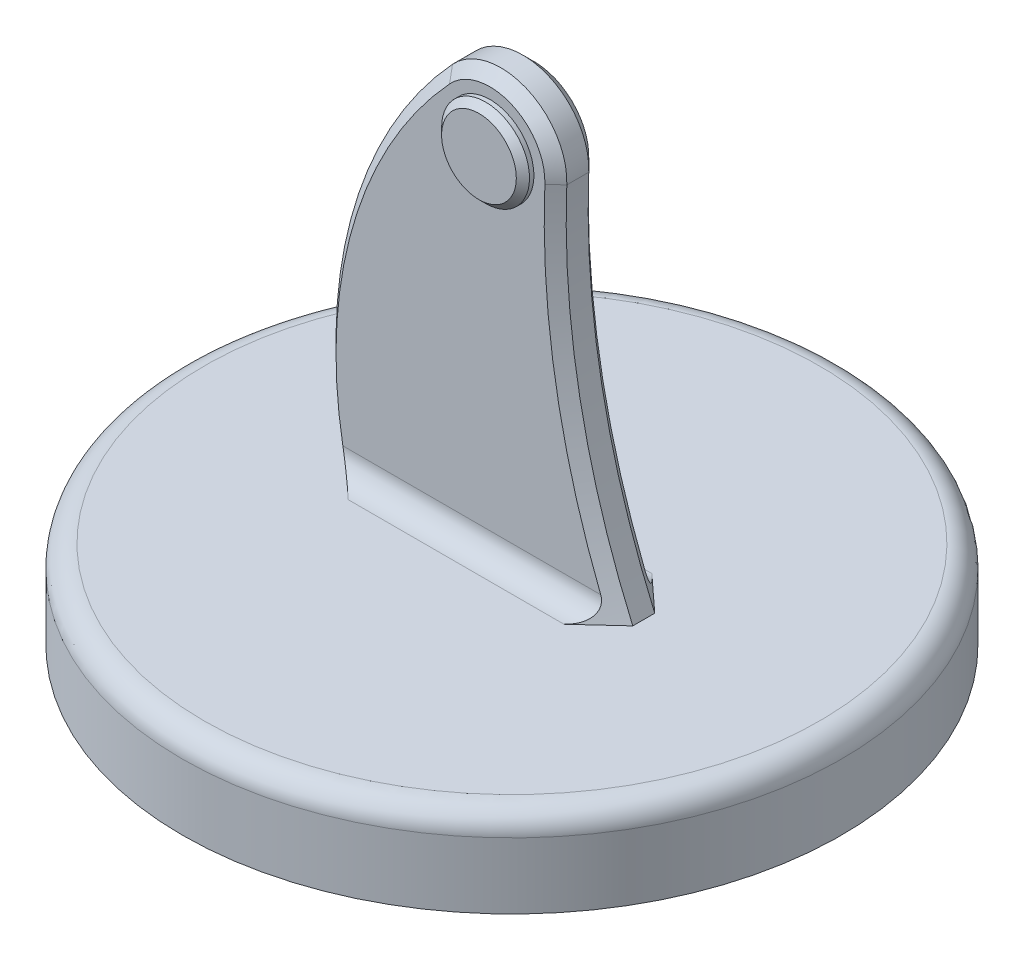
ISO-10303-21;
HEADER;
FILE_DESCRIPTION(('STEP AP214'),'2;1');
FILE_NAME('part.step','',(''),(''),'','','');
FILE_SCHEMA(('AUTOMOTIVE_DESIGN { 1 0 10303 214 1 1 1 1 }'));
ENDSEC;
DATA;
#1=APPLICATION_CONTEXT('core data for automotive mechanical design processes');
#2=APPLICATION_PROTOCOL_DEFINITION('international standard','automotive_design',2000,#1);
#3=PRODUCT_CONTEXT('',#1,'mechanical');
#4=PRODUCT('Part','Part','',(#3));
#5=PRODUCT_RELATED_PRODUCT_CATEGORY('part','',(#4));
#6=PRODUCT_DEFINITION_FORMATION('','',#4);
#7=PRODUCT_DEFINITION_CONTEXT('part definition',#1,'design');
#8=PRODUCT_DEFINITION('design','',#6,#7);
#9=PRODUCT_DEFINITION_SHAPE('','',#8);
#10=(LENGTH_UNIT() NAMED_UNIT(*) SI_UNIT(.MILLI.,.METRE.));
#11=(NAMED_UNIT(*) PLANE_ANGLE_UNIT() SI_UNIT($,.RADIAN.));
#12=(NAMED_UNIT(*) SI_UNIT($,.STERADIAN.) SOLID_ANGLE_UNIT());
#13=UNCERTAINTY_MEASURE_WITH_UNIT(LENGTH_MEASURE(1.E-05),#10,'distance_accuracy_value','');
#14=(GEOMETRIC_REPRESENTATION_CONTEXT(3) GLOBAL_UNCERTAINTY_ASSIGNED_CONTEXT((#13)) GLOBAL_UNIT_ASSIGNED_CONTEXT((#10,
#11,#12)) REPRESENTATION_CONTEXT('',''));
#15=CARTESIAN_POINT('',(0.,0.,0.));
#16=DIRECTION('',(0.,0.,1.));
#17=DIRECTION('',(1.,0.,0.));
#18=AXIS2_PLACEMENT_3D('',#15,#16,#17);
#19=CARTESIAN_POINT('',(0.,20.,0.));
#20=DIRECTION('',(0.,-1.,0.));
#21=DIRECTION('',(0.,0.,-1.));
#22=AXIS2_PLACEMENT_3D('',#19,#20,#21);
#23=CYLINDRICAL_SURFACE('',#22,75.);
#24=CARTESIAN_POINT('',(0.,15.,0.));
#25=DIRECTION('',(0.,1.,0.));
#26=DIRECTION('',(0.,0.,1.));
#27=AXIS2_PLACEMENT_3D('',#24,#25,#26);
#28=CIRCLE('',#27,75.);
#29=CARTESIAN_POINT('',(0.,15.,75.));
#30=VERTEX_POINT('',#29);
#31=EDGE_CURVE('E157',#30,#30,#28,.F.);
#32=ORIENTED_EDGE('',*,*,#31,.T.);
#33=EDGE_LOOP('',(#32));
#34=FACE_BOUND('',#33,.T.);
#35=CARTESIAN_POINT('',(0.,0.,0.));
#36=DIRECTION('',(0.,1.,0.));
#37=DIRECTION('',(0.,0.,1.));
#38=AXIS2_PLACEMENT_3D('',#35,#36,#37);
#39=CIRCLE('',#38,75.);
#40=CARTESIAN_POINT('',(0.,0.,75.));
#41=VERTEX_POINT('',#40);
#42=EDGE_CURVE('E140',#41,#41,#39,.T.);
#43=ORIENTED_EDGE('',*,*,#42,.T.);
#44=EDGE_LOOP('',(#43));
#45=FACE_BOUND('',#44,.T.);
#46=ADVANCED_FACE('F50',(#34,#45),#23,.T.);
#47=CARTESIAN_POINT('',(0.,20.,0.));
#48=DIRECTION('',(0.,1.,0.));
#49=DIRECTION('',(0.,0.,1.));
#50=AXIS2_PLACEMENT_3D('',#47,#48,#49);
#51=PLANE('',#50);
#52=DIRECTION('',(1.,0.,0.));
#53=VECTOR('',#52,1.);
#54=CARTESIAN_POINT('',(27.2737881575031,20.,-10.));
#55=LINE('',#54,#53);
#56=CARTESIAN_POINT('',(-27.2887355473297,20.,-10.));
#57=VERTEX_POINT('',#56);
#58=CARTESIAN_POINT('',(21.8418637199152,20.,-10.));
#59=VERTEX_POINT('',#58);
#60=EDGE_CURVE('E237',#57,#59,#55,.T.);
#61=ORIENTED_EDGE('',*,*,#60,.T.);
#62=CARTESIAN_POINT('',(21.8418637199152,20.,-10.0000000000159));
#63=CARTESIAN_POINT('',(22.7461882017297,20.,-9.16558426966586));
#64=CARTESIAN_POINT('',(23.6509965192312,20.,-8.33169268853577));
#65=CARTESIAN_POINT('',(25.4616234405496,20.,-6.66500921803442));
#66=CARTESIAN_POINT('',(26.3674420431797,20.,-5.83221732737389));
#67=CARTESIAN_POINT('',(27.7278878786498,20.,-4.58304046288528));
#68=CARTESIAN_POINT('',(28.1821200176084,20.,-4.1662251546363));
#69=CARTESIAN_POINT('',(29.0908553232679,20.,-3.33288955358244));
#70=CARTESIAN_POINT('',(29.5453584901279,20.,-2.91636926095111));
#71=CARTESIAN_POINT('',(30.,20.,-2.50000000000006));
#72=B_SPLINE_CURVE_WITH_KNOTS('',3,(#62,#63,#64,#65,#66,#67,#68,#69,#70,#71),.UNSPECIFIED.,.F.,
.F.,(4,2,2,2,4),(0.,3.69140512288142,7.38280591413322,9.23228046194418,11.0817560968989),.UNSPECIFIED.);
#73=CARTESIAN_POINT('',(30.,20.,-2.50000000000005));
#74=VERTEX_POINT('',#73);
#75=EDGE_CURVE('E149',#59,#74,#72,.T.);
#76=ORIENTED_EDGE('',*,*,#75,.T.);
#77=DIRECTION('',(0.,0.,-1.));
#78=VECTOR('',#77,1.);
#79=CARTESIAN_POINT('',(30.,20.,5.));
#80=LINE('',#79,#78);
#81=CARTESIAN_POINT('',(30.,20.,2.5));
#82=VERTEX_POINT('',#81);
#83=EDGE_CURVE('E139',#82,#74,#80,.T.);
#84=ORIENTED_EDGE('',*,*,#83,.F.);
#85=CARTESIAN_POINT('',(30.,20.,2.5));
#86=CARTESIAN_POINT('',(29.5453584901279,20.,2.91636926095106));
#87=CARTESIAN_POINT('',(29.0908553232678,20.,3.3328895535824));
#88=CARTESIAN_POINT('',(28.1821200176084,20.,4.16622515463628));
#89=CARTESIAN_POINT('',(27.7278878786498,20.,4.58304046288527));
#90=CARTESIAN_POINT('',(26.3674420431826,20.,5.83221732737125));
#91=CARTESIAN_POINT('',(25.4616234405553,20.,6.66500921802913));
#92=CARTESIAN_POINT('',(23.6509965192427,20.,8.33169268852517));
#93=CARTESIAN_POINT('',(22.746188201744,20.,9.1655842696526));
#94=CARTESIAN_POINT('',(21.8418637199324,20.,10.));
#95=B_SPLINE_CURVE_WITH_KNOTS('',3,(#85,#86,#87,#88,#89,#90,#91,#92,#93,#94),.UNSPECIFIED.,.F.,
.F.,(4,2,2,2,4),(0.,1.84947563495476,3.69895018276575,7.39035097400581,11.0817560968755),.UNSPECIFIED.);
#96=CARTESIAN_POINT('',(21.8418637199324,20.,10.));
#97=VERTEX_POINT('',#96);
#98=EDGE_CURVE('E207',#82,#97,#95,.T.);
#99=ORIENTED_EDGE('',*,*,#98,.T.);
#100=DIRECTION('',(1.,0.,0.));
#101=VECTOR('',#100,1.);
#102=CARTESIAN_POINT('',(0.,20.,10.));
#103=LINE('',#102,#101);
#104=CARTESIAN_POINT('',(-27.2887355473191,20.,10.));
#105=VERTEX_POINT('',#104);
#106=EDGE_CURVE('E335',#97,#105,#103,.F.);
#107=ORIENTED_EDGE('',*,*,#106,.T.);
#108=CARTESIAN_POINT('',(-27.2887355473191,20.,10.));
#109=CARTESIAN_POINT('',(-28.1468298222042,20.,9.16734576652844));
#110=CARTESIAN_POINT('',(-29.004577468134,20.,8.33433437714162));
#111=CARTESIAN_POINT('',(-30.7194292699949,20.,6.66765018811386));
#112=CARTESIAN_POINT('',(-31.5765334261847,20.,5.83397738873913));
#113=CARTESIAN_POINT('',(-32.8612617911927,20.,4.58348152868409));
#114=CARTESIAN_POINT('',(-33.2891085540013,20.,4.16688708166744));
#115=CARTESIAN_POINT('',(-34.1446597093332,20.,3.33355184941637));
#116=CARTESIAN_POINT('',(-34.5723641018279,20.,2.91681106415259));
#117=CARTESIAN_POINT('',(-35.,20.,2.5));
#118=B_SPLINE_CURVE_WITH_KNOTS('',3,(#108,#109,#110,#111,#112,#113,#114,#115,#116,#117),
.UNSPECIFIED.,.F.,.F.,(4,2,2,2,4),(0.,3.58702503188647,7.17404862068496,8.96553793676738,
10.7570276125337),.UNSPECIFIED.);
#119=CARTESIAN_POINT('',(-35.,20.,2.5));
#120=VERTEX_POINT('',#119);
#121=EDGE_CURVE('E133',#105,#120,#118,.T.);
#122=ORIENTED_EDGE('',*,*,#121,.T.);
#123=DIRECTION('',(0.,0.,-1.));
#124=VECTOR('',#123,1.);
#125=CARTESIAN_POINT('',(-35.,20.,5.));
#126=LINE('',#125,#124);
#127=CARTESIAN_POINT('',(-35.,20.,-2.50000000000005));
#128=VERTEX_POINT('',#127);
#129=EDGE_CURVE('E123',#120,#128,#126,.T.);
#130=ORIENTED_EDGE('',*,*,#129,.T.);
#131=CARTESIAN_POINT('',(-35.,20.,-2.50000000000005));
#132=CARTESIAN_POINT('',(-34.5723641018279,20.,-2.91681106415264));
#133=CARTESIAN_POINT('',(-34.1446597093332,20.,-3.33355184941641));
#134=CARTESIAN_POINT('',(-33.2891085540013,20.,-4.16688708166746));
#135=CARTESIAN_POINT('',(-32.8612617911927,20.,-4.5834815286841));
#136=CARTESIAN_POINT('',(-31.5765334261864,20.,-5.83397738873742));
#137=CARTESIAN_POINT('',(-30.7194292699984,20.,-6.66765018811043));
#138=CARTESIAN_POINT('',(-29.0045774681411,20.,-8.33433437713477));
#139=CARTESIAN_POINT('',(-28.146829822213,20.,-9.16734576651988));
#140=CARTESIAN_POINT('',(-27.2887355473297,20.,-9.99999999998973));
#141=B_SPLINE_CURVE_WITH_KNOTS('',3,(#131,#132,#133,#134,#135,#136,#137,#138,#139,#140),
.UNSPECIFIED.,.F.,.F.,(4,2,2,2,4),(0.,1.79148967576627,3.58297899184866,7.17000258063981,
10.7570276125189),.UNSPECIFIED.);
#142=EDGE_CURVE('E128',#128,#57,#141,.T.);
#143=ORIENTED_EDGE('',*,*,#142,.T.);
#144=EDGE_LOOP('',(#61,#76,#84,#99,#107,#122,#130,#143));
#145=FACE_BOUND('',#144,.T.);
#146=CARTESIAN_POINT('',(0.,20.,0.));
#147=DIRECTION('',(0.,1.,0.));
#148=DIRECTION('',(0.,0.,1.));
#149=AXIS2_PLACEMENT_3D('',#146,#147,#148);
#150=CIRCLE('',#149,70.);
#151=CARTESIAN_POINT('',(0.,20.,70.));
#152=VERTEX_POINT('',#151);
#153=EDGE_CURVE('E163',#152,#152,#150,.T.);
#154=ORIENTED_EDGE('',*,*,#153,.T.);
#155=EDGE_LOOP('',(#154));
#156=FACE_BOUND('',#155,.T.);
#157=ADVANCED_FACE('F129',(#145,#156),#51,.T.);
#158=CARTESIAN_POINT('',(0.,0.,0.));
#159=DIRECTION('',(0.,1.,0.));
#160=DIRECTION('',(0.,0.,1.));
#161=AXIS2_PLACEMENT_3D('',#158,#159,#160);
#162=PLANE('',#161);
#163=ORIENTED_EDGE('',*,*,#42,.F.);
#164=EDGE_LOOP('',(#163));
#165=FACE_BOUND('',#164,.T.);
#166=ADVANCED_FACE('F195',(#165),#162,.F.);
#167=CARTESIAN_POINT('',(0.,15.,0.));
#168=DIRECTION('',(0.,1.,0.));
#169=DIRECTION('',(0.,0.,1.));
#170=AXIS2_PLACEMENT_3D('',#167,#168,#169);
#171=TOROIDAL_SURFACE('',#170,70.,5.);
#172=ORIENTED_EDGE('',*,*,#31,.F.);
#173=EDGE_LOOP('',(#172));
#174=FACE_BOUND('',#173,.T.);
#175=ORIENTED_EDGE('',*,*,#153,.F.);
#176=EDGE_LOOP('',(#175));
#177=FACE_BOUND('',#176,.T.);
#178=ADVANCED_FACE('F295',(#174,#177),#171,.T.);
#179=CARTESIAN_POINT('',(62.4686842011093,42.3574506620147,5.));
#180=DIRECTION('',(0.,0.,-1.));
#181=DIRECTION('',(-1.,0.,0.));
#182=AXIS2_PLACEMENT_3D('',#179,#180,#181);
#183=CYLINDRICAL_SURFACE('',#182,100.);
#184=ORIENTED_EDGE('',*,*,#129,.F.);
#185=CARTESIAN_POINT('',(62.4686842011093,42.3574506620147,2.5));
#186=DIRECTION('',(0.,0.,-1.));
#187=DIRECTION('',(-1.,0.,0.));
#188=AXIS2_PLACEMENT_3D('',#185,#186,#187);
#189=CIRCLE('',#188,100.);
#190=CARTESIAN_POINT('',(-11.0238854472546,110.172214589056,2.5));
#191=VERTEX_POINT('',#190);
#192=EDGE_CURVE('E349',#120,#191,#189,.T.);
#193=ORIENTED_EDGE('',*,*,#192,.T.);
#194=DIRECTION('',(0.,0.,-1.));
#195=VECTOR('',#194,1.);
#196=CARTESIAN_POINT('',(-11.0238854472546,110.172214589056,5.));
#197=LINE('',#196,#195);
#198=CARTESIAN_POINT('',(-11.0238854472546,110.172214589056,-2.50000000000005));
#199=VERTEX_POINT('',#198);
#200=EDGE_CURVE('E153',#191,#199,#197,.T.);
#201=ORIENTED_EDGE('',*,*,#200,.T.);
#202=CARTESIAN_POINT('',(62.4686842011093,42.3574506620147,-2.50000000000005));
#203=DIRECTION('',(0.,0.,-1.));
#204=DIRECTION('',(-1.,0.,0.));
#205=AXIS2_PLACEMENT_3D('',#202,#203,#204);
#206=CIRCLE('',#205,100.);
#207=EDGE_CURVE('E144',#199,#128,#206,.F.);
#208=ORIENTED_EDGE('',*,*,#207,.T.);
#209=EDGE_LOOP('',(#184,#193,#201,#208));
#210=FACE_BOUND('',#209,.T.);
#211=ADVANCED_FACE('F152',(#210),#183,.T.);
#212=CARTESIAN_POINT('',(194.847381809951,92.2865181787317,5.));
#213=DIRECTION('',(0.,0.,-1.));
#214=DIRECTION('',(-1.,0.,0.));
#215=AXIS2_PLACEMENT_3D('',#212,#213,#214);
#216=CYLINDRICAL_SURFACE('',#215,180.);
#217=DIRECTION('',(0.,0.,-1.));
#218=VECTOR('',#217,1.);
#219=CARTESIAN_POINT('',(14.988260139227,99.4066552445178,5.));
#220=LINE('',#219,#218);
#221=CARTESIAN_POINT('',(14.988260139227,99.4066552445178,2.5));
#222=VERTEX_POINT('',#221);
#223=CARTESIAN_POINT('',(14.988260139227,99.4066552445178,-2.50000000000005));
#224=VERTEX_POINT('',#223);
#225=EDGE_CURVE('E311',#222,#224,#220,.T.);
#226=ORIENTED_EDGE('',*,*,#225,.F.);
#227=CARTESIAN_POINT('',(194.847381809951,92.2865181787317,2.5));
#228=DIRECTION('',(0.,0.,-1.));
#229=DIRECTION('',(-1.,0.,0.));
#230=AXIS2_PLACEMENT_3D('',#227,#228,#229);
#231=CIRCLE('',#230,180.);
#232=EDGE_CURVE('E210',#222,#82,#231,.F.);
#233=ORIENTED_EDGE('',*,*,#232,.T.);
#234=ORIENTED_EDGE('',*,*,#83,.T.);
#235=CARTESIAN_POINT('',(194.847381809951,92.2865181787317,-2.50000000000005));
#236=DIRECTION('',(0.,0.,-1.));
#237=DIRECTION('',(-1.,0.,0.));
#238=AXIS2_PLACEMENT_3D('',#235,#236,#237);
#239=CIRCLE('',#238,180.);
#240=EDGE_CURVE('E146',#74,#224,#239,.T.);
#241=ORIENTED_EDGE('',*,*,#240,.T.);
#242=EDGE_LOOP('',(#226,#233,#234,#241));
#243=FACE_BOUND('',#242,.T.);
#244=ADVANCED_FACE('F301',(#243),#216,.F.);
#245=CARTESIAN_POINT('',(0.,100.,5.));
#246=DIRECTION('',(0.,0.,-1.));
#247=DIRECTION('',(-1.,0.,0.));
#248=AXIS2_PLACEMENT_3D('',#245,#246,#247);
#249=CYLINDRICAL_SURFACE('',#248,15.);
#250=ORIENTED_EDGE('',*,*,#200,.F.);
#251=CARTESIAN_POINT('',(0.,100.,2.5));
#252=DIRECTION('',(0.,0.,-1.));
#253=DIRECTION('',(-1.,0.,0.));
#254=AXIS2_PLACEMENT_3D('',#251,#252,#253);
#255=CIRCLE('',#254,15.);
#256=EDGE_CURVE('E352',#191,#222,#255,.T.);
#257=ORIENTED_EDGE('',*,*,#256,.T.);
#258=ORIENTED_EDGE('',*,*,#225,.T.);
#259=CARTESIAN_POINT('',(0.,100.,-2.50000000000005));
#260=DIRECTION('',(0.,0.,-1.));
#261=DIRECTION('',(-1.,0.,0.));
#262=AXIS2_PLACEMENT_3D('',#259,#260,#261);
#263=CIRCLE('',#262,15.);
#264=EDGE_CURVE('E166',#224,#199,#263,.F.);
#265=ORIENTED_EDGE('',*,*,#264,.T.);
#266=EDGE_LOOP('',(#250,#257,#258,#265));
#267=FACE_BOUND('',#266,.T.);
#268=ADVANCED_FACE('F369',(#267),#249,.T.);
#269=CARTESIAN_POINT('',(62.4686842011093,42.3574506620147,5.));
#270=DIRECTION('',(0.,0.,-1.));
#271=DIRECTION('',(-1.,0.,0.));
#272=AXIS2_PLACEMENT_3D('',#269,#270,#271);
#273=PLANE('',#272);
#274=CARTESIAN_POINT('',(0.,100.,5.));
#275=DIRECTION('',(0.,0.,-1.));
#276=DIRECTION('',(-1.,0.,0.));
#277=AXIS2_PLACEMENT_3D('',#274,#275,#276);
#278=CIRCLE('',#277,10.);
#279=CARTESIAN_POINT('',(-10.,100.,5.));
#280=VERTEX_POINT('',#279);
#281=EDGE_CURVE('E272',#280,#280,#278,.F.);
#282=ORIENTED_EDGE('',*,*,#281,.F.);
#283=EDGE_LOOP('',(#282));
#284=FACE_BOUND('',#283,.T.);
#285=CARTESIAN_POINT('',(62.4686842011093,42.3574506620147,5.));
#286=DIRECTION('',(0.,0.,-1.));
#287=DIRECTION('',(-1.,0.,0.));
#288=AXIS2_PLACEMENT_3D('',#285,#286,#287);
#289=CIRCLE('',#288,97.5);
#290=CARTESIAN_POINT('',(-9.18657120604549,108.47684549088,5.));
#291=VERTEX_POINT('',#290);
#292=CARTESIAN_POINT('',(-33.4738449844178,25.,5.));
#293=VERTEX_POINT('',#292);
#294=EDGE_CURVE('E341',#291,#293,#289,.F.);
#295=ORIENTED_EDGE('',*,*,#294,.T.);
#296=DIRECTION('',(1.,0.,0.));
#297=VECTOR('',#296,1.);
#298=CARTESIAN_POINT('',(62.4686842011093,25.,5.));
#299=LINE('',#298,#297);
#300=CARTESIAN_POINT('',(25.2043021651182,25.,5.));
#301=VERTEX_POINT('',#300);
#302=EDGE_CURVE('E326',#293,#301,#299,.T.);
#303=ORIENTED_EDGE('',*,*,#302,.T.);
#304=CARTESIAN_POINT('',(194.847381809951,92.2865181787317,5.));
#305=DIRECTION('',(0.,0.,-1.));
#306=DIRECTION('',(-1.,0.,0.));
#307=AXIS2_PLACEMENT_3D('',#304,#305,#306);
#308=CIRCLE('',#307,182.5);
#309=CARTESIAN_POINT('',(12.4902167826892,99.5055460370982,5.));
#310=VERTEX_POINT('',#309);
#311=EDGE_CURVE('E342',#301,#310,#308,.T.);
#312=ORIENTED_EDGE('',*,*,#311,.T.);
#313=CARTESIAN_POINT('',(0.,100.,5.));
#314=DIRECTION('',(0.,0.,-1.));
#315=DIRECTION('',(-1.,0.,0.));
#316=AXIS2_PLACEMENT_3D('',#313,#314,#315);
#317=CIRCLE('',#316,12.5);
#318=EDGE_CURVE('E348',#310,#291,#317,.F.);
#319=ORIENTED_EDGE('',*,*,#318,.T.);
#320=EDGE_LOOP('',(#295,#303,#312,#319));
#321=FACE_BOUND('',#320,.T.);
#322=ADVANCED_FACE('F347',(#284,#321),#273,.F.);
#323=CARTESIAN_POINT('',(62.4686842011093,42.3574506620147,-5.));
#324=DIRECTION('',(0.,0.,-1.));
#325=DIRECTION('',(-1.,0.,0.));
#326=AXIS2_PLACEMENT_3D('',#323,#324,#325);
#327=PLANE('',#326);
#328=CARTESIAN_POINT('',(0.,100.,-5.));
#329=DIRECTION('',(0.,0.,-1.));
#330=DIRECTION('',(-1.,0.,0.));
#331=AXIS2_PLACEMENT_3D('',#328,#329,#330);
#332=CIRCLE('',#331,5.);
#333=CARTESIAN_POINT('',(-5.,100.,-5.));
#334=VERTEX_POINT('',#333);
#335=EDGE_CURVE('E314',#334,#334,#332,.T.);
#336=ORIENTED_EDGE('',*,*,#335,.F.);
#337=EDGE_LOOP('',(#336));
#338=FACE_BOUND('',#337,.T.);
#339=CARTESIAN_POINT('',(194.847381809951,92.2865181787317,-5.));
#340=DIRECTION('',(0.,0.,-1.));
#341=DIRECTION('',(-1.,0.,0.));
#342=AXIS2_PLACEMENT_3D('',#339,#340,#341);
#343=CIRCLE('',#342,182.5);
#344=CARTESIAN_POINT('',(12.4902167826893,99.5055460370982,-5.));
#345=VERTEX_POINT('',#344);
#346=CARTESIAN_POINT('',(25.2043021651183,25.,-5.));
#347=VERTEX_POINT('',#346);
#348=EDGE_CURVE('E151',#345,#347,#343,.F.);
#349=ORIENTED_EDGE('',*,*,#348,.T.);
#350=DIRECTION('',(1.,0.,0.));
#351=VECTOR('',#350,1.);
#352=CARTESIAN_POINT('',(-32.4333410665085,25.,-5.));
#353=LINE('',#352,#351);
#354=CARTESIAN_POINT('',(-33.4738449844178,25.,-5.));
#355=VERTEX_POINT('',#354);
#356=EDGE_CURVE('E66',#347,#355,#353,.F.);
#357=ORIENTED_EDGE('',*,*,#356,.T.);
#358=CARTESIAN_POINT('',(62.4686842011093,42.3574506620147,-5.));
#359=DIRECTION('',(0.,0.,-1.));
#360=DIRECTION('',(-1.,0.,0.));
#361=AXIS2_PLACEMENT_3D('',#358,#359,#360);
#362=CIRCLE('',#361,97.5);
#363=CARTESIAN_POINT('',(-9.18657120604552,108.47684549088,-5.));
#364=VERTEX_POINT('',#363);
#365=EDGE_CURVE('E168',#355,#364,#362,.T.);
#366=ORIENTED_EDGE('',*,*,#365,.T.);
#367=CARTESIAN_POINT('',(0.,100.,-5.));
#368=DIRECTION('',(0.,0.,-1.));
#369=DIRECTION('',(-1.,0.,0.));
#370=AXIS2_PLACEMENT_3D('',#367,#368,#369);
#371=CIRCLE('',#370,12.5);
#372=EDGE_CURVE('E159',#364,#345,#371,.T.);
#373=ORIENTED_EDGE('',*,*,#372,.T.);
#374=EDGE_LOOP('',(#349,#357,#366,#373));
#375=FACE_BOUND('',#374,.T.);
#376=ADVANCED_FACE('F390',(#338,#375),#327,.T.);
#377=CARTESIAN_POINT('',(194.847381809951,92.2865181787317,-2.50000000000005));
#378=DIRECTION('',(0.,0.,-1.));
#379=DIRECTION('',(-1.,0.,0.));
#380=AXIS2_PLACEMENT_3D('',#377,#378,#379);
#381=CONICAL_SURFACE('',#380,180.,0.785398163397448);
#382=ORIENTED_EDGE('',*,*,#75,.F.);
#383=CARTESIAN_POINT('',(21.8418637199152,20.,-10.));
#384=CARTESIAN_POINT('',(21.9957841242411,20.0000311641874,-9.85796701490306));
#385=CARTESIAN_POINT('',(22.1486092807908,20.0060550866653,-9.71466089934673));
#386=CARTESIAN_POINT('',(22.4514218939749,20.0309593432819,-9.42573520284697));
#387=CARTESIAN_POINT('',(22.6014046846443,20.0498592035919,-9.28011243677293));
#388=CARTESIAN_POINT('',(22.8990681682958,20.101679650961,-8.98558212631812));
#389=CARTESIAN_POINT('',(23.0467043255544,20.1347547513471,-8.83665605960584));
#390=CARTESIAN_POINT('',(23.3366063607361,20.2160473587844,-8.53789538907129));
#391=CARTESIAN_POINT('',(23.4788755561245,20.2642553341193,-8.3880614152112));
#392=CARTESIAN_POINT('',(23.8175840215619,20.4018945880914,-8.02248028662777));
#393=CARTESIAN_POINT('',(24.0104532993257,20.5001332198933,-7.80661068369257));
#394=CARTESIAN_POINT('',(24.3754812460387,20.7350093115281,-7.37911109915173));
#395=CARTESIAN_POINT('',(24.5477082868233,20.8715147064277,-7.16746917182315));
#396=CARTESIAN_POINT('',(24.8294037811796,21.1538801663821,-6.79856403286463));
#397=CARTESIAN_POINT('',(24.9444243981567,21.2915441171842,-6.6393256829432));
#398=CARTESIAN_POINT('',(25.150545661423,21.5949973602833,-6.33225286313702));
#399=CARTESIAN_POINT('',(25.2416673187825,21.760761735189,-6.18440845743588));
#400=CARTESIAN_POINT('',(25.3797108361567,22.0872276503708,-5.9317842145424));
#401=CARTESIAN_POINT('',(25.4316302086409,22.2434988409359,-5.82403753261526));
#402=CARTESIAN_POINT('',(25.5114817525219,22.5717639286185,-5.62502684000153));
#403=CARTESIAN_POINT('',(25.5394450446952,22.7437371051065,-5.53374156684422));
#404=CARTESIAN_POINT('',(25.5694157026621,23.0996012661948,-5.37108585099701));
#405=CARTESIAN_POINT('',(25.5713540284185,23.2835226507961,-5.29976887090453));
#406=CARTESIAN_POINT('',(25.5490709291724,23.6573555602824,-5.17963377130567));
#407=CARTESIAN_POINT('',(25.5248031362994,23.847277123554,-5.13085574954506));
#408=CARTESIAN_POINT('',(25.4573128885594,24.1999856168684,-5.06161925276152));
#409=CARTESIAN_POINT('',(25.417259875795,24.3628079335932,-5.03812938621557));
#410=CARTESIAN_POINT('',(25.3455829275549,24.6043026255528,-5.01502712991331));
#411=CARTESIAN_POINT('',(25.3198047901778,24.6842271208234,-5.00934794426066));
#412=CARTESIAN_POINT('',(25.2646693722036,24.8429832363216,-5.00183481056809));
#413=CARTESIAN_POINT('',(25.2353134904834,24.9218152703536,-4.99999936472004));
#414=CARTESIAN_POINT('',(25.2043021651183,25.,-4.99999999999995));
#415=B_SPLINE_CURVE_WITH_KNOTS('',3,(#383,#384,#385,#386,#387,#388,#389,#390,#391,#392,#393,
#394,#395,#396,#397,#398,#399,#400,#401,#402,#403,#404,#405,#406,#407,#408,#409,#410,#411,#412,
#413,#414),.UNSPECIFIED.,.F.,.F.,(4,2,2,2,2,2,2,2,2,2,2,2,2,2,2,4),(0.,0.628311542617848,
1.25757803770154,1.89388546776362,2.52979290951867,3.44425482559749,4.35559883378614,
5.07268545098209,5.78913950304187,6.3770142816542,6.96412420297541,7.55279132539537,
8.14250171681596,8.64873471055376,8.90109891427355,9.15336475973634),.UNSPECIFIED.);
#416=EDGE_CURVE('E64',#59,#347,#415,.T.);
#417=ORIENTED_EDGE('',*,*,#416,.T.);
#418=ORIENTED_EDGE('',*,*,#348,.F.);
#419=DIRECTION('',(-0.70655335884236,0.0279705400121966,-0.707106781186552));
#420=VECTOR('',#419,1.);
#421=CARTESIAN_POINT('',(14.988260139227,99.4066552445178,-2.50000000000005));
#422=LINE('',#421,#420);
#423=EDGE_CURVE('E313',#224,#345,#422,.T.);
#424=ORIENTED_EDGE('',*,*,#423,.F.);
#425=ORIENTED_EDGE('',*,*,#240,.F.);
#426=EDGE_LOOP('',(#382,#417,#418,#424,#425));
#427=FACE_BOUND('',#426,.T.);
#428=ADVANCED_FACE('F227',(#427),#381,.F.);
#429=CARTESIAN_POINT('',(0.,100.,-2.50000000000005));
#430=DIRECTION('',(0.,0.,1.));
#431=DIRECTION('',(1.,0.,0.));
#432=AXIS2_PLACEMENT_3D('',#429,#430,#431);
#433=CONICAL_SURFACE('',#432,15.,0.785398163397453);
#434=ORIENTED_EDGE('',*,*,#423,.T.);
#435=ORIENTED_EDGE('',*,*,#372,.F.);
#436=DIRECTION('',(0.519670943651829,-0.479522794373763,-0.707106781186544));
#437=VECTOR('',#436,1.);
#438=CARTESIAN_POINT('',(-11.0238854472546,110.172214589056,-2.50000000000005));
#439=LINE('',#438,#437);
#440=EDGE_CURVE('E330',#199,#364,#439,.T.);
#441=ORIENTED_EDGE('',*,*,#440,.F.);
#442=ORIENTED_EDGE('',*,*,#264,.F.);
#443=EDGE_LOOP('',(#434,#435,#441,#442));
#444=FACE_BOUND('',#443,.T.);
#445=ADVANCED_FACE('F367',(#444),#433,.T.);
#446=CARTESIAN_POINT('',(62.4686842011093,42.3574506620147,-2.50000000000005));
#447=DIRECTION('',(0.,0.,1.));
#448=DIRECTION('',(1.,0.,0.));
#449=AXIS2_PLACEMENT_3D('',#446,#447,#448);
#450=CONICAL_SURFACE('',#449,100.,0.785398163397457);
#451=ORIENTED_EDGE('',*,*,#440,.T.);
#452=ORIENTED_EDGE('',*,*,#365,.F.);
#453=CARTESIAN_POINT('',(-33.4738449844178,25.,-5.));
#454=CARTESIAN_POINT('',(-33.4515992625684,24.8768674188132,-4.99997259739676));
#455=CARTESIAN_POINT('',(-33.4245978512178,24.7546808648249,-5.00454672287279));
#456=CARTESIAN_POINT('',(-33.3619560081373,24.5133900471888,-5.02227524217762));
#457=CARTESIAN_POINT('',(-33.3263304634952,24.3942808593073,-5.03541491551385));
#458=CARTESIAN_POINT('',(-33.247662973741,24.1611866563281,-5.06946876252335));
#459=CARTESIAN_POINT('',(-33.2047063196856,24.0471598714489,-5.09029641695441));
#460=CARTESIAN_POINT('',(-33.1119687309504,23.8234684716054,-5.13904463116084));
#461=CARTESIAN_POINT('',(-33.0621849485942,23.71380570168,-5.16696815487555));
#462=CARTESIAN_POINT('',(-32.9046073677075,23.3936182940039,-5.2598885427859));
#463=CARTESIAN_POINT('',(-32.7879595823811,23.1900974519237,-5.33431752558091));
#464=CARTESIAN_POINT('',(-32.536567831661,22.803129813626,-5.5034898626011));
#465=CARTESIAN_POINT('',(-32.4017656988382,22.6197511324875,-5.59829912376261));
#466=CARTESIAN_POINT('',(-32.1440958165288,22.3044181547989,-5.78559741902007));
#467=CARTESIAN_POINT('',(-32.0233779772181,22.1691217033943,-5.87549276259949));
#468=CARTESIAN_POINT('',(-31.7748360062966,21.9119505139523,-6.06434012274971));
#469=CARTESIAN_POINT('',(-31.6470083432764,21.7900825369813,-6.16329665602052));
#470=CARTESIAN_POINT('',(-31.3856077794218,21.5591471575823,-6.36895573004358));
#471=CARTESIAN_POINT('',(-31.2520244651024,21.4501044127978,-6.47567257351717));
#472=CARTESIAN_POINT('',(-30.9805839613877,21.244609176031,-6.69550685105883));
#473=CARTESIAN_POINT('',(-30.8427270070023,21.1481559932561,-6.80862393345551));
#474=CARTESIAN_POINT('',(-30.5118924561473,20.9338107373713,-7.08337027164788));
#475=CARTESIAN_POINT('',(-30.3174531193037,20.8212548247564,-7.24741804579599));
#476=CARTESIAN_POINT('',(-29.9243800180386,20.6180707316773,-7.58394063592569));
#477=CARTESIAN_POINT('',(-29.7257443947088,20.5274525006295,-7.75641923308376));
#478=CARTESIAN_POINT('',(-29.3261429098794,20.3677076688028,-8.10813741906377));
#479=CARTESIAN_POINT('',(-29.1251788628156,20.2985653662275,-8.28737196035385));
#480=CARTESIAN_POINT('',(-28.7223029586743,20.1815106774745,-8.65141130726713));
#481=CARTESIAN_POINT('',(-28.5203915942226,20.1335882770988,-8.83621344133231));
#482=CARTESIAN_POINT('',(-28.1459632467723,20.0644313785647,-9.18340012199708));
#483=CARTESIAN_POINT('',(-27.9734041718974,20.0403458118835,-9.34517660426435));
#484=CARTESIAN_POINT('',(-27.6298299035736,20.0081705784446,-9.67096634040663));
#485=CARTESIAN_POINT('',(-27.4588117450479,20.0000364469896,-9.83497208972884));
#486=CARTESIAN_POINT('',(-27.2887355473247,20.,-9.99999999999459));
#487=B_SPLINE_CURVE_WITH_KNOTS('',3,(#453,#454,#455,#456,#457,#458,#459,#460,#461,#462,#463,
#464,#465,#466,#467,#468,#469,#470,#471,#472,#473,#474,#475,#476,#477,#478,#479,#480,#481,#482,
#483,#484,#485,#486),.UNSPECIFIED.,.F.,.F.,(4,2,2,2,2,2,2,2,2,2,2,2,2,2,2,2,4),(0.,
0.375075194642622,0.749507489686233,1.11984843694557,1.49034433034545,2.2256344288018,
2.96333911726423,3.56966774486671,4.17630026960772,4.78408066704758,5.39182770138936,
6.22521944815103,7.05898845868664,7.89214642897674,8.7249107912184,9.43764526195642,
10.1483901421125),.UNSPECIFIED.);
#488=EDGE_CURVE('E147',#355,#57,#487,.T.);
#489=ORIENTED_EDGE('',*,*,#488,.T.);
#490=ORIENTED_EDGE('',*,*,#142,.F.);
#491=ORIENTED_EDGE('',*,*,#207,.F.);
#492=EDGE_LOOP('',(#451,#452,#489,#490,#491));
#493=FACE_BOUND('',#492,.T.);
#494=ADVANCED_FACE('F141',(#493),#450,.T.);
#495=CARTESIAN_POINT('',(194.847381809951,92.2865181787317,5.));
#496=DIRECTION('',(0.,0.,1.));
#497=DIRECTION('',(1.,0.,0.));
#498=AXIS2_PLACEMENT_3D('',#495,#496,#497);
#499=CONICAL_SURFACE('',#498,182.5,0.785398163397448);
#500=ORIENTED_EDGE('',*,*,#98,.F.);
#501=ORIENTED_EDGE('',*,*,#232,.F.);
#502=DIRECTION('',(0.706553358842363,-0.0279705400121958,-0.707106781186548));
#503=VECTOR('',#502,1.);
#504=CARTESIAN_POINT('',(12.4902167826892,99.5055460370982,5.));
#505=LINE('',#504,#503);
#506=EDGE_CURVE('E324',#310,#222,#505,.T.);
#507=ORIENTED_EDGE('',*,*,#506,.F.);
#508=ORIENTED_EDGE('',*,*,#311,.F.);
#509=CARTESIAN_POINT('',(25.2043021651182,25.,5.));
#510=CARTESIAN_POINT('',(25.2406935724085,24.9082713297293,4.99999134719655));
#511=CARTESIAN_POINT('',(25.2748102949413,24.8156052854517,5.00252419639078));
#512=CARTESIAN_POINT('',(25.3380601225273,24.6288055090529,5.01292170197801));
#513=CARTESIAN_POINT('',(25.3671892799382,24.5346706781001,5.02079055759295));
#514=CARTESIAN_POINT('',(25.4200335713848,24.3452619368222,5.04213496752587));
#515=CARTESIAN_POINT('',(25.4437356915276,24.2499858532497,5.05562378462205));
#516=CARTESIAN_POINT('',(25.485207102949,24.059151263254,5.08836369959163));
#517=CARTESIAN_POINT('',(25.502977930558,23.9635928364434,5.1076133028454));
#518=CARTESIAN_POINT('',(25.5323089599231,23.7724024231486,5.1520436466343));
#519=CARTESIAN_POINT('',(25.5438391211189,23.6767722615319,5.17725225110298));
#520=CARTESIAN_POINT('',(25.5603038049874,23.4866242233903,5.23349957717741));
#521=CARTESIAN_POINT('',(25.5652360328634,23.3921067451859,5.2645403229547));
#522=CARTESIAN_POINT('',(25.5683665020247,23.2052206524277,5.33217199565326));
#523=CARTESIAN_POINT('',(25.5665808848885,23.1128474228949,5.36874941619354));
#524=CARTESIAN_POINT('',(25.5563281868834,22.9307232015413,5.44720645291996));
#525=CARTESIAN_POINT('',(25.5478586449273,22.8409731882406,5.48908801737469));
#526=CARTESIAN_POINT('',(25.5250559572061,22.6697597226347,5.57522443832959));
#527=CARTESIAN_POINT('',(25.5110798078701,22.5881142245959,5.61921289601382));
#528=CARTESIAN_POINT('',(25.4775575651625,22.4282336573543,5.71111516243307));
#529=CARTESIAN_POINT('',(25.4580096454483,22.3499997161194,5.75903025458472));
#530=CARTESIAN_POINT('',(25.391431003421,22.1209060801623,5.90806127739237));
#531=CARTESIAN_POINT('',(25.3364706960618,21.9756928086901,6.01444351195314));
#532=CARTESIAN_POINT('',(25.1868922763279,21.6561452218499,6.27516852649895));
#533=CARTESIAN_POINT('',(25.0851503066046,21.4885144152724,6.43358344734415));
#534=CARTESIAN_POINT('',(24.856987788997,21.1839157472372,6.76151237766206));
#535=CARTESIAN_POINT('',(24.7305302387697,21.0469945302544,6.93104277233994));
#536=CARTESIAN_POINT('',(24.4013418229239,20.7494917805759,7.34964373595368));
#537=CARTESIAN_POINT('',(24.1890926274082,20.6037528713011,7.6017810297426));
#538=CARTESIAN_POINT('',(23.8527756097949,20.423270153777,7.98175629360059));
#539=CARTESIAN_POINT('',(23.7374129669671,20.3693893117168,8.10898397594197));
#540=CARTESIAN_POINT('',(23.5017615966222,20.2734832005027,8.36338719107905));
#541=CARTESIAN_POINT('',(23.3814737565157,20.2314558062927,8.49056272913558));
#542=CARTESIAN_POINT('',(23.1457651353905,20.1610833245135,8.73512929622135));
#543=CARTESIAN_POINT('',(23.0306158404395,20.1319719986338,8.85256666640525));
#544=CARTESIAN_POINT('',(22.7975265475089,20.0826917697385,9.08656098587598));
#545=CARTESIAN_POINT('',(22.679586302604,20.0625236611003,9.20311785604926));
#546=CARTESIAN_POINT('',(22.442651555577,20.0307992110399,9.43388930279979));
#547=CARTESIAN_POINT('',(22.3236796598708,20.0191581217302,9.54811564678104));
#548=CARTESIAN_POINT('',(22.0839908409541,20.0037662287196,9.77515581226257));
#549=CARTESIAN_POINT('',(21.9632747433783,20.0000118075222,9.88797025776452));
#550=CARTESIAN_POINT('',(21.8418637199324,20.,10.));
#551=B_SPLINE_CURVE_WITH_KNOTS('',3,(#509,#510,#511,#512,#513,#514,#515,#516,#517,#518,#519,
#520,#521,#522,#523,#524,#525,#526,#527,#528,#529,#530,#531,#532,#533,#534,#535,#536,#537,#538,
#539,#540,#541,#542,#543,#544,#545,#546,#547,#548,#549,#550),.UNSPECIFIED.,.F.,.F.,(4,2,2,2,2,2,
2,2,2,2,2,2,2,2,2,2,2,2,2,2,4),(0.,0.29603654475675,0.592306329117198,0.889279288959831,
1.18617526670799,1.48448797514078,1.7829044113883,2.08060427372804,2.37841380327802,
2.65945535835951,2.94058914079588,3.50298485987018,4.25511697152365,5.00838386669865,
6.083141179831,6.62283639599942,7.16243479539004,7.66325403016349,8.1641177410866,
8.65993332675415,9.15552143953763),.UNSPECIFIED.);
#552=EDGE_CURVE('E239',#301,#97,#551,.T.);
#553=ORIENTED_EDGE('',*,*,#552,.T.);
#554=EDGE_LOOP('',(#500,#501,#507,#508,#553));
#555=FACE_BOUND('',#554,.T.);
#556=ADVANCED_FACE('F255',(#555),#499,.F.);
#557=CARTESIAN_POINT('',(0.,100.,5.));
#558=DIRECTION('',(0.,0.,-1.));
#559=DIRECTION('',(-1.,0.,0.));
#560=AXIS2_PLACEMENT_3D('',#557,#558,#559);
#561=CONICAL_SURFACE('',#560,12.5,0.785398163397448);
#562=ORIENTED_EDGE('',*,*,#506,.T.);
#563=ORIENTED_EDGE('',*,*,#256,.F.);
#564=DIRECTION('',(-0.519670943651828,0.479522794373759,-0.707106781186548));
#565=VECTOR('',#564,1.);
#566=CARTESIAN_POINT('',(-9.18657120604549,108.47684549088,5.));
#567=LINE('',#566,#565);
#568=EDGE_CURVE('E318',#291,#191,#567,.T.);
#569=ORIENTED_EDGE('',*,*,#568,.F.);
#570=ORIENTED_EDGE('',*,*,#318,.F.);
#571=EDGE_LOOP('',(#562,#563,#569,#570));
#572=FACE_BOUND('',#571,.T.);
#573=ADVANCED_FACE('F221',(#572),#561,.T.);
#574=CARTESIAN_POINT('',(62.4686842011093,42.3574506620147,5.));
#575=DIRECTION('',(0.,0.,-1.));
#576=DIRECTION('',(-1.,0.,0.));
#577=AXIS2_PLACEMENT_3D('',#574,#575,#576);
#578=CONICAL_SURFACE('',#577,97.5,0.785398163397448);
#579=ORIENTED_EDGE('',*,*,#568,.T.);
#580=ORIENTED_EDGE('',*,*,#192,.F.);
#581=ORIENTED_EDGE('',*,*,#121,.F.);
#582=CARTESIAN_POINT('',(-27.2887355473191,20.,10.));
#583=CARTESIAN_POINT('',(-27.394036301273,20.0000055691069,9.89782232414134));
#584=CARTESIAN_POINT('',(-27.4996932920062,20.0031317902154,9.79604355208955));
#585=CARTESIAN_POINT('',(-27.7115319166587,20.0155231798255,9.59342275406973));
#586=CARTESIAN_POINT('',(-27.8177135160786,20.024787949839,9.49258066772696));
#587=CARTESIAN_POINT('',(-28.1368603718817,20.0616459944248,9.19157605953375));
#588=CARTESIAN_POINT('',(-28.350351925744,20.0983028546268,8.99300863995497));
#589=CARTESIAN_POINT('',(-28.7789107228025,20.1957579678777,8.59976307789927));
#590=CARTESIAN_POINT('',(-28.9939753229426,20.2567655713579,8.4051344579716));
#591=CARTESIAN_POINT('',(-29.422137086543,20.4029167363565,8.02296612915017));
#592=CARTESIAN_POINT('',(-29.6352348579973,20.4880525623513,7.8354241700727));
#593=CARTESIAN_POINT('',(-30.0105078719335,20.6611714518163,7.50991039572085));
#594=CARTESIAN_POINT('',(-30.1734419053033,20.7442860524302,7.37021055336329));
#595=CARTESIAN_POINT('',(-30.4959743967793,20.9257456234403,7.09701186940393));
#596=CARTESIAN_POINT('',(-30.6555735385814,21.0240874365922,6.96351174977999));
#597=CARTESIAN_POINT('',(-30.9697856348194,21.2362579041339,6.70421014729733));
#598=CARTESIAN_POINT('',(-31.1244113337402,21.3500422894404,6.57838809642822));
#599=CARTESIAN_POINT('',(-31.4275142417251,21.5938984155883,6.33556736292779));
#600=CARTESIAN_POINT('',(-31.5759939292801,21.7239635040876,6.21856510761065));
#601=CARTESIAN_POINT('',(-31.9152292969681,22.0494122653306,5.95628277417805));
#602=CARTESIAN_POINT('',(-32.1027418496133,22.251786250824,5.81530854960125));
#603=CARTESIAN_POINT('',(-32.456491420823,22.6889784914519,5.5589080795486));
#604=CARTESIAN_POINT('',(-32.6227478812055,22.9237666841766,5.44345841658542));
#605=CARTESIAN_POINT('',(-32.8882336397402,23.3652654479978,5.27036886279248));
#606=CARTESIAN_POINT('',(-32.9939645043747,23.5651344011238,5.20550298446229));
#607=CARTESIAN_POINT('',(-33.1350683601297,23.8770787640057,5.12654723409633));
#608=CARTESIAN_POINT('',(-33.1791522435327,23.9829719072919,5.10329992313168));
#609=CARTESIAN_POINT('',(-33.2608433493621,24.1984217022504,5.06345692873123));
#610=CARTESIAN_POINT('',(-33.2984538871756,24.3079764440584,5.04685783453058));
#611=CARTESIAN_POINT('',(-33.361534800642,24.5139523774097,5.02276374141832));
#612=CARTESIAN_POINT('',(-33.3879754947099,24.6099628468981,5.01429496800144));
#613=CARTESIAN_POINT('',(-33.4352388645141,24.8037849426549,5.00290440145768));
#614=CARTESIAN_POINT('',(-33.456055492498,24.9015983879822,4.99998855937676));
#615=CARTESIAN_POINT('',(-33.4738449844178,25.,5.));
#616=B_SPLINE_CURVE_WITH_KNOTS('',3,(#582,#583,#584,#585,#586,#587,#588,#589,#590,#591,#592,
#593,#594,#595,#596,#597,#598,#599,#600,#601,#602,#603,#604,#605,#606,#607,#608,#609,#610,#611,
#612,#613,#614,#615),.UNSPECIFIED.,.F.,.F.,(4,2,2,2,2,2,2,2,2,2,2,2,2,2,2,2,4),(0.,
0.440102384662826,0.880176202577285,1.76063939191981,2.6488410975621,3.5367583666761,
4.2266742307928,4.91644723729224,5.60428307643602,6.29183877574143,7.21836730336584,
8.14404222787089,8.84693882657326,9.19768720032274,9.54825539683057,9.84777196389779,
10.1476093409821),.UNSPECIFIED.);
#617=EDGE_CURVE('E233',#105,#293,#616,.T.);
#618=ORIENTED_EDGE('',*,*,#617,.T.);
#619=ORIENTED_EDGE('',*,*,#294,.F.);
#620=EDGE_LOOP('',(#579,#580,#581,#618,#619));
#621=FACE_BOUND('',#620,.T.);
#622=ADVANCED_FACE('F217',(#621),#578,.T.);
#623=CARTESIAN_POINT('',(62.4686842011093,25.,10.));
#624=DIRECTION('',(1.,0.,0.));
#625=DIRECTION('',(0.,0.,-1.));
#626=AXIS2_PLACEMENT_3D('',#623,#624,#625);
#627=CYLINDRICAL_SURFACE('',#626,5.);
#628=ORIENTED_EDGE('',*,*,#617,.F.);
#629=ORIENTED_EDGE('',*,*,#106,.F.);
#630=ORIENTED_EDGE('',*,*,#552,.F.);
#631=ORIENTED_EDGE('',*,*,#302,.F.);
#632=EDGE_LOOP('',(#628,#629,#630,#631));
#633=FACE_BOUND('',#632,.T.);
#634=ADVANCED_FACE('F224',(#633),#627,.F.);
#635=CARTESIAN_POINT('',(0.,25.,-10.));
#636=DIRECTION('',(-1.,0.,0.));
#637=DIRECTION('',(0.,0.,1.));
#638=AXIS2_PLACEMENT_3D('',#635,#636,#637);
#639=CYLINDRICAL_SURFACE('',#638,5.);
#640=ORIENTED_EDGE('',*,*,#488,.F.);
#641=ORIENTED_EDGE('',*,*,#356,.F.);
#642=ORIENTED_EDGE('',*,*,#416,.F.);
#643=ORIENTED_EDGE('',*,*,#60,.F.);
#644=EDGE_LOOP('',(#640,#641,#642,#643));
#645=FACE_BOUND('',#644,.T.);
#646=ADVANCED_FACE('F248',(#645),#639,.F.);
#647=CARTESIAN_POINT('',(0.,100.,7.5));
#648=DIRECTION('',(0.,0.,-1.));
#649=DIRECTION('',(-1.,0.,0.));
#650=AXIS2_PLACEMENT_3D('',#647,#648,#649);
#651=CYLINDRICAL_SURFACE('',#650,10.);
#652=CARTESIAN_POINT('',(0.,100.,6.));
#653=DIRECTION('',(0.,0.,1.));
#654=DIRECTION('',(1.,0.,0.));
#655=AXIS2_PLACEMENT_3D('',#652,#653,#654);
#656=CIRCLE('',#655,10.);
#657=CARTESIAN_POINT('',(10.,100.,6.));
#658=VERTEX_POINT('',#657);
#659=EDGE_CURVE('E11',#658,#658,#656,.F.);
#660=ORIENTED_EDGE('',*,*,#659,.T.);
#661=EDGE_LOOP('',(#660));
#662=FACE_BOUND('',#661,.T.);
#663=ORIENTED_EDGE('',*,*,#281,.T.);
#664=EDGE_LOOP('',(#663));
#665=FACE_BOUND('',#664,.T.);
#666=ADVANCED_FACE('F260',(#662,#665),#651,.T.);
#667=CARTESIAN_POINT('',(0.,100.,7.5));
#668=DIRECTION('',(0.,0.,1.));
#669=DIRECTION('',(1.,0.,0.));
#670=AXIS2_PLACEMENT_3D('',#667,#668,#669);
#671=PLANE('',#670);
#672=CARTESIAN_POINT('',(0.,100.,7.5));
#673=DIRECTION('',(0.,0.,1.));
#674=DIRECTION('',(1.,0.,0.));
#675=AXIS2_PLACEMENT_3D('',#672,#673,#674);
#676=CIRCLE('',#675,8.49999999999998);
#677=CARTESIAN_POINT('',(8.49999999999998,100.,7.5));
#678=VERTEX_POINT('',#677);
#679=EDGE_CURVE('E57',#678,#678,#676,.T.);
#680=ORIENTED_EDGE('',*,*,#679,.T.);
#681=EDGE_LOOP('',(#680));
#682=FACE_BOUND('',#681,.T.);
#683=ADVANCED_FACE('F277',(#682),#671,.T.);
#684=CARTESIAN_POINT('',(0.,100.,5.));
#685=DIRECTION('',(0.,0.,-1.));
#686=DIRECTION('',(-1.,0.,0.));
#687=AXIS2_PLACEMENT_3D('',#684,#685,#686);
#688=CYLINDRICAL_SURFACE('',#687,5.);
#689=CARTESIAN_POINT('',(0.,100.,5.));
#690=DIRECTION('',(0.,0.,-1.));
#691=DIRECTION('',(-1.,0.,0.));
#692=AXIS2_PLACEMENT_3D('',#689,#690,#691);
#693=CIRCLE('',#692,5.);
#694=CARTESIAN_POINT('',(-5.,100.,5.));
#695=VERTEX_POINT('',#694);
#696=EDGE_CURVE('E319',#695,#695,#693,.T.);
#697=ORIENTED_EDGE('',*,*,#696,.F.);
#698=EDGE_LOOP('',(#697));
#699=FACE_BOUND('',#698,.T.);
#700=ORIENTED_EDGE('',*,*,#335,.T.);
#701=EDGE_LOOP('',(#700));
#702=FACE_BOUND('',#701,.T.);
#703=ADVANCED_FACE('F281',(#699,#702),#688,.F.);
#704=CARTESIAN_POINT('',(0.,100.,5.));
#705=DIRECTION('',(0.,0.,-1.));
#706=DIRECTION('',(-1.,0.,0.));
#707=AXIS2_PLACEMENT_3D('',#704,#705,#706);
#708=PLANE('',#707);
#709=ORIENTED_EDGE('',*,*,#696,.T.);
#710=EDGE_LOOP('',(#709));
#711=FACE_BOUND('',#710,.T.);
#712=ADVANCED_FACE('F276',(#711),#708,.T.);
#713=CARTESIAN_POINT('',(0.,100.,7.5));
#714=DIRECTION('',(0.,0.,-1.));
#715=DIRECTION('',(-1.,0.,0.));
#716=AXIS2_PLACEMENT_3D('',#713,#714,#715);
#717=CONICAL_SURFACE('',#716,8.49999999999998,0.785398163397455);
#718=ORIENTED_EDGE('',*,*,#659,.F.);
#719=EDGE_LOOP('',(#718));
#720=FACE_BOUND('',#719,.T.);
#721=ORIENTED_EDGE('',*,*,#679,.F.);
#722=EDGE_LOOP('',(#721));
#723=FACE_BOUND('',#722,.T.);
#724=ADVANCED_FACE('F49',(#720,#723),#717,.T.);
#725=CLOSED_SHELL('',(#46,#157,#166,#178,#211,#244,#268,#322,#376,#428,#445,#494,#556,#573,#622,
#634,#646,#666,#683,#703,#712,#724));
#726=MANIFOLD_SOLID_BREP('B2',#725);
#727=ADVANCED_BREP_SHAPE_REPRESENTATION('',(#18,#726),#14);
#728=SHAPE_DEFINITION_REPRESENTATION(#9,#727);
ENDSEC;
END-ISO-10303-21;
